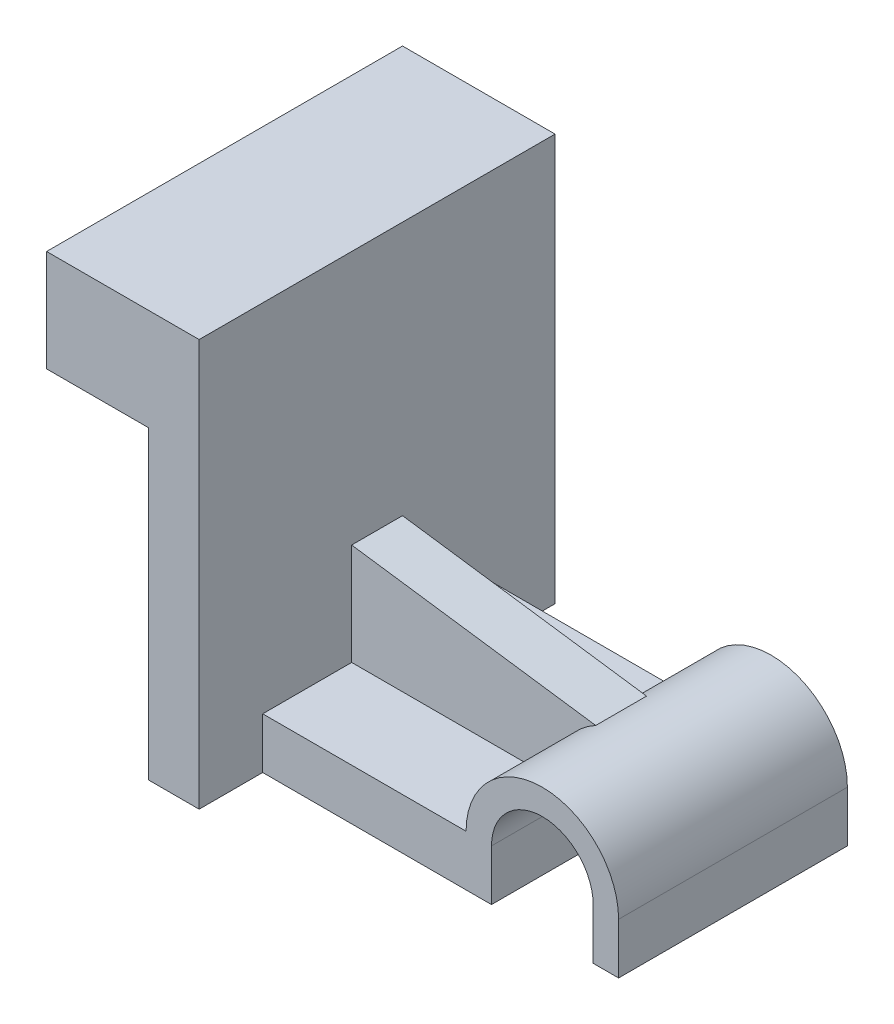
ISO-10303-21;
HEADER;
FILE_DESCRIPTION(('STEP AP214'),'2;1');
FILE_NAME('part.step','',(''),(''),'','','');
FILE_SCHEMA(('AUTOMOTIVE_DESIGN { 1 0 10303 214 1 1 1 1 }'));
ENDSEC;
DATA;
#1=APPLICATION_CONTEXT('core data for automotive mechanical design processes');
#2=APPLICATION_PROTOCOL_DEFINITION('international standard','automotive_design',2000,#1);
#3=PRODUCT_CONTEXT('',#1,'mechanical');
#4=PRODUCT('Part','Part','',(#3));
#5=PRODUCT_RELATED_PRODUCT_CATEGORY('part','',(#4));
#6=PRODUCT_DEFINITION_FORMATION('','',#4);
#7=PRODUCT_DEFINITION_CONTEXT('part definition',#1,'design');
#8=PRODUCT_DEFINITION('design','',#6,#7);
#9=PRODUCT_DEFINITION_SHAPE('','',#8);
#10=(LENGTH_UNIT() NAMED_UNIT(*) SI_UNIT(.MILLI.,.METRE.));
#11=(NAMED_UNIT(*) PLANE_ANGLE_UNIT() SI_UNIT($,.RADIAN.));
#12=(NAMED_UNIT(*) SI_UNIT($,.STERADIAN.) SOLID_ANGLE_UNIT());
#13=UNCERTAINTY_MEASURE_WITH_UNIT(LENGTH_MEASURE(1.E-05),#10,'distance_accuracy_value','');
#14=(GEOMETRIC_REPRESENTATION_CONTEXT(3) GLOBAL_UNCERTAINTY_ASSIGNED_CONTEXT((#13)) GLOBAL_UNIT_ASSIGNED_CONTEXT((#10,
#11,#12)) REPRESENTATION_CONTEXT('',''));
#15=CARTESIAN_POINT('',(0.,0.,0.));
#16=DIRECTION('',(0.,0.,1.));
#17=DIRECTION('',(1.,0.,0.));
#18=AXIS2_PLACEMENT_3D('',#15,#16,#17);
#19=CARTESIAN_POINT('',(0.,0.,-45.));
#20=DIRECTION('',(0.,0.,1.));
#21=DIRECTION('',(1.,0.,0.));
#22=AXIS2_PLACEMENT_3D('',#19,#20,#21);
#23=CYLINDRICAL_SURFACE('',#22,10.);
#24=CARTESIAN_POINT('',(0.,0.,0.));
#25=DIRECTION('',(0.,0.,1.));
#26=DIRECTION('',(1.,0.,0.));
#27=AXIS2_PLACEMENT_3D('',#24,#25,#26);
#28=CIRCLE('',#27,10.);
#29=CARTESIAN_POINT('',(10.,0.,0.));
#30=VERTEX_POINT('',#29);
#31=CARTESIAN_POINT('',(-10.,0.,0.));
#32=VERTEX_POINT('',#31);
#33=EDGE_CURVE('E272',#30,#32,#28,.T.);
#34=ORIENTED_EDGE('',*,*,#33,.T.);
#35=DIRECTION('',(0.,0.,1.));
#36=VECTOR('',#35,1.);
#37=CARTESIAN_POINT('',(-10.,0.,-45.));
#38=LINE('',#37,#36);
#39=CARTESIAN_POINT('',(-10.,0.,-45.));
#40=VERTEX_POINT('',#39);
#41=EDGE_CURVE('E298',#40,#32,#38,.T.);
#42=ORIENTED_EDGE('',*,*,#41,.F.);
#43=CARTESIAN_POINT('',(0.,0.,-45.));
#44=DIRECTION('',(0.,0.,1.));
#45=DIRECTION('',(1.,0.,0.));
#46=AXIS2_PLACEMENT_3D('',#43,#44,#45);
#47=CIRCLE('',#46,10.);
#48=CARTESIAN_POINT('',(10.,0.,-45.));
#49=VERTEX_POINT('',#48);
#50=EDGE_CURVE('E249',#49,#40,#47,.T.);
#51=ORIENTED_EDGE('',*,*,#50,.F.);
#52=DIRECTION('',(0.,0.,1.));
#53=VECTOR('',#52,1.);
#54=CARTESIAN_POINT('',(10.,0.,-45.));
#55=LINE('',#54,#53);
#56=EDGE_CURVE('E300',#49,#30,#55,.T.);
#57=ORIENTED_EDGE('',*,*,#56,.T.);
#58=EDGE_LOOP('',(#34,#42,#51,#57));
#59=FACE_BOUND('',#58,.T.);
#60=ADVANCED_FACE('F33',(#59),#23,.F.);
#61=CARTESIAN_POINT('',(-15.,0.,-45.));
#62=DIRECTION('',(0.,1.,0.));
#63=DIRECTION('',(-1.,0.,0.));
#64=AXIS2_PLACEMENT_3D('',#61,#62,#63);
#65=PLANE('',#64);
#66=DIRECTION('',(0.,0.,1.));
#67=VECTOR('',#66,1.);
#68=CARTESIAN_POINT('',(-15.,0.,-45.));
#69=LINE('',#68,#67);
#70=CARTESIAN_POINT('',(-15.,0.,-17.5));
#71=VERTEX_POINT('',#70);
#72=CARTESIAN_POINT('',(-15.,0.,0.));
#73=VERTEX_POINT('',#72);
#74=EDGE_CURVE('E288',#71,#73,#69,.T.);
#75=ORIENTED_EDGE('',*,*,#74,.F.);
#76=DIRECTION('',(-1.,0.,0.));
#77=VECTOR('',#76,1.);
#78=CARTESIAN_POINT('',(-6.99999999999999,0.,-17.5));
#79=LINE('',#78,#77);
#80=CARTESIAN_POINT('',(-55.,0.,-17.5));
#81=VERTEX_POINT('',#80);
#82=EDGE_CURVE('E187',#71,#81,#79,.T.);
#83=ORIENTED_EDGE('',*,*,#82,.T.);
#84=DIRECTION('',(0.,0.,1.));
#85=VECTOR('',#84,1.);
#86=CARTESIAN_POINT('',(-55.,0.,-45.));
#87=LINE('',#86,#85);
#88=CARTESIAN_POINT('',(-55.,0.,0.));
#89=VERTEX_POINT('',#88);
#90=EDGE_CURVE('E180',#81,#89,#87,.T.);
#91=ORIENTED_EDGE('',*,*,#90,.T.);
#92=DIRECTION('',(-1.,0.,0.));
#93=VECTOR('',#92,1.);
#94=CARTESIAN_POINT('',(-15.,0.,0.));
#95=LINE('',#94,#93);
#96=EDGE_CURVE('E282',#73,#89,#95,.T.);
#97=ORIENTED_EDGE('',*,*,#96,.F.);
#98=EDGE_LOOP('',(#75,#83,#91,#97));
#99=FACE_BOUND('',#98,.T.);
#100=ADVANCED_FACE('F317',(#99),#65,.T.);
#101=CARTESIAN_POINT('',(-55.,0.,-45.));
#102=VERTEX_POINT('',#101);
#103=CARTESIAN_POINT('',(-55.,0.,-27.5));
#104=VERTEX_POINT('',#103);
#105=EDGE_CURVE('E292',#102,#104,#87,.T.);
#106=ORIENTED_EDGE('',*,*,#105,.T.);
#107=DIRECTION('',(-1.,0.,0.));
#108=VECTOR('',#107,1.);
#109=CARTESIAN_POINT('',(-6.99999999999999,0.,-27.5));
#110=LINE('',#109,#108);
#111=CARTESIAN_POINT('',(-15.,0.,-27.5));
#112=VERTEX_POINT('',#111);
#113=EDGE_CURVE('E168',#112,#104,#110,.T.);
#114=ORIENTED_EDGE('',*,*,#113,.F.);
#115=CARTESIAN_POINT('',(-15.,0.,-45.));
#116=VERTEX_POINT('',#115);
#117=EDGE_CURVE('E289',#116,#112,#69,.T.);
#118=ORIENTED_EDGE('',*,*,#117,.F.);
#119=DIRECTION('',(-1.,0.,0.));
#120=VECTOR('',#119,1.);
#121=CARTESIAN_POINT('',(-15.,0.,-45.));
#122=LINE('',#121,#120);
#123=EDGE_CURVE('E258',#116,#102,#122,.T.);
#124=ORIENTED_EDGE('',*,*,#123,.T.);
#125=EDGE_LOOP('',(#106,#114,#118,#124));
#126=FACE_BOUND('',#125,.T.);
#127=ADVANCED_FACE('F347',(#126),#65,.T.);
#128=CARTESIAN_POINT('',(0.,0.,-45.));
#129=DIRECTION('',(0.,0.,1.));
#130=DIRECTION('',(1.,0.,0.));
#131=AXIS2_PLACEMENT_3D('',#128,#129,#130);
#132=CYLINDRICAL_SURFACE('',#131,15.);
#133=CARTESIAN_POINT('',(0.,0.,-27.5));
#134=DIRECTION('',(0.,0.,1.));
#135=DIRECTION('',(1.,0.,0.));
#136=AXIS2_PLACEMENT_3D('',#133,#134,#135);
#137=CIRCLE('',#136,15.);
#138=CARTESIAN_POINT('',(-6.99999999999999,13.2664991614216,-27.5));
#139=VERTEX_POINT('',#138);
#140=EDGE_CURVE('E189',#112,#139,#137,.F.);
#141=ORIENTED_EDGE('',*,*,#140,.T.);
#142=DIRECTION('',(0.,0.,1.));
#143=VECTOR('',#142,1.);
#144=CARTESIAN_POINT('',(-6.99999999999999,13.2664991614216,-45.));
#145=LINE('',#144,#143);
#146=CARTESIAN_POINT('',(-6.99999999999999,13.2664991614216,-17.5));
#147=VERTEX_POINT('',#146);
#148=EDGE_CURVE('E11',#139,#147,#145,.T.);
#149=ORIENTED_EDGE('',*,*,#148,.T.);
#150=CARTESIAN_POINT('',(0.,0.,-17.5));
#151=DIRECTION('',(0.,0.,-1.));
#152=DIRECTION('',(-1.,0.,0.));
#153=AXIS2_PLACEMENT_3D('',#150,#151,#152);
#154=CIRCLE('',#153,15.);
#155=EDGE_CURVE('E54',#147,#71,#154,.F.);
#156=ORIENTED_EDGE('',*,*,#155,.T.);
#157=ORIENTED_EDGE('',*,*,#74,.T.);
#158=CARTESIAN_POINT('',(0.,0.,0.));
#159=DIRECTION('',(0.,0.,1.));
#160=DIRECTION('',(1.,0.,0.));
#161=AXIS2_PLACEMENT_3D('',#158,#159,#160);
#162=CIRCLE('',#161,15.);
#163=CARTESIAN_POINT('',(15.,0.,0.));
#164=VERTEX_POINT('',#163);
#165=EDGE_CURVE('E244',#164,#73,#162,.T.);
#166=ORIENTED_EDGE('',*,*,#165,.F.);
#167=DIRECTION('',(0.,0.,1.));
#168=VECTOR('',#167,1.);
#169=CARTESIAN_POINT('',(15.,0.,-45.));
#170=LINE('',#169,#168);
#171=CARTESIAN_POINT('',(15.,0.,-45.));
#172=VERTEX_POINT('',#171);
#173=EDGE_CURVE('E263',#172,#164,#170,.T.);
#174=ORIENTED_EDGE('',*,*,#173,.F.);
#175=CARTESIAN_POINT('',(0.,0.,-45.));
#176=DIRECTION('',(0.,0.,1.));
#177=DIRECTION('',(1.,0.,0.));
#178=AXIS2_PLACEMENT_3D('',#175,#176,#177);
#179=CIRCLE('',#178,15.);
#180=EDGE_CURVE('E261',#172,#116,#179,.T.);
#181=ORIENTED_EDGE('',*,*,#180,.T.);
#182=ORIENTED_EDGE('',*,*,#117,.T.);
#183=EDGE_LOOP('',(#141,#149,#156,#157,#166,#174,#181,#182));
#184=FACE_BOUND('',#183,.T.);
#185=ADVANCED_FACE('F314',(#184),#132,.T.);
#186=CARTESIAN_POINT('',(-55.,0.,0.));
#187=DIRECTION('',(-1.,0.,0.));
#188=DIRECTION('',(0.,0.,1.));
#189=AXIS2_PLACEMENT_3D('',#186,#187,#188);
#190=PLANE('',#189);
#191=DIRECTION('',(0.,0.,1.));
#192=VECTOR('',#191,1.);
#193=CARTESIAN_POINT('',(-55.,20.,-17.5));
#194=LINE('',#193,#192);
#195=CARTESIAN_POINT('',(-55.,20.,-27.5));
#196=VERTEX_POINT('',#195);
#197=CARTESIAN_POINT('',(-55.,20.,-17.5));
#198=VERTEX_POINT('',#197);
#199=EDGE_CURVE('E161',#196,#198,#194,.T.);
#200=ORIENTED_EDGE('',*,*,#199,.F.);
#201=DIRECTION('',(0.,1.,0.));
#202=VECTOR('',#201,1.);
#203=CARTESIAN_POINT('',(-55.,0.,-27.5));
#204=LINE('',#203,#202);
#205=EDGE_CURVE('E169',#104,#196,#204,.T.);
#206=ORIENTED_EDGE('',*,*,#205,.F.);
#207=ORIENTED_EDGE('',*,*,#105,.F.);
#208=DIRECTION('',(0.,-1.,0.));
#209=VECTOR('',#208,1.);
#210=CARTESIAN_POINT('',(-55.,0.,-45.));
#211=LINE('',#210,#209);
#212=CARTESIAN_POINT('',(-55.,-10.,-45.));
#213=VERTEX_POINT('',#212);
#214=EDGE_CURVE('E255',#102,#213,#211,.T.);
#215=ORIENTED_EDGE('',*,*,#214,.T.);
#216=DIRECTION('',(0.,0.,1.));
#217=VECTOR('',#216,1.);
#218=CARTESIAN_POINT('',(-55.,-10.,-57.5));
#219=LINE('',#218,#217);
#220=CARTESIAN_POINT('',(-55.,-10.,-57.5));
#221=VERTEX_POINT('',#220);
#222=EDGE_CURVE('E223',#221,#213,#219,.T.);
#223=ORIENTED_EDGE('',*,*,#222,.F.);
#224=DIRECTION('',(0.,-1.,0.));
#225=VECTOR('',#224,1.);
#226=CARTESIAN_POINT('',(-55.,70.,-57.5));
#227=LINE('',#226,#225);
#228=CARTESIAN_POINT('',(-55.,70.,-57.5));
#229=VERTEX_POINT('',#228);
#230=EDGE_CURVE('E208',#229,#221,#227,.T.);
#231=ORIENTED_EDGE('',*,*,#230,.F.);
#232=DIRECTION('',(0.,0.,1.));
#233=VECTOR('',#232,1.);
#234=CARTESIAN_POINT('',(-55.,70.,-57.5));
#235=LINE('',#234,#233);
#236=CARTESIAN_POINT('',(-55.,70.,12.5));
#237=VERTEX_POINT('',#236);
#238=EDGE_CURVE('E214',#229,#237,#235,.T.);
#239=ORIENTED_EDGE('',*,*,#238,.T.);
#240=DIRECTION('',(0.,-1.,0.));
#241=VECTOR('',#240,1.);
#242=CARTESIAN_POINT('',(-55.,70.,12.5));
#243=LINE('',#242,#241);
#244=CARTESIAN_POINT('',(-55.,-10.,12.5));
#245=VERTEX_POINT('',#244);
#246=EDGE_CURVE('E226',#237,#245,#243,.T.);
#247=ORIENTED_EDGE('',*,*,#246,.T.);
#248=CARTESIAN_POINT('',(-55.,-10.,0.));
#249=VERTEX_POINT('',#248);
#250=EDGE_CURVE('E222',#249,#245,#219,.T.);
#251=ORIENTED_EDGE('',*,*,#250,.F.);
#252=DIRECTION('',(0.,-1.,0.));
#253=VECTOR('',#252,1.);
#254=CARTESIAN_POINT('',(-55.,0.,0.));
#255=LINE('',#254,#253);
#256=EDGE_CURVE('E279',#89,#249,#255,.T.);
#257=ORIENTED_EDGE('',*,*,#256,.F.);
#258=ORIENTED_EDGE('',*,*,#90,.F.);
#259=DIRECTION('',(0.,-1.,0.));
#260=VECTOR('',#259,1.);
#261=CARTESIAN_POINT('',(-55.,0.,-17.5));
#262=LINE('',#261,#260);
#263=EDGE_CURVE('E175',#198,#81,#262,.T.);
#264=ORIENTED_EDGE('',*,*,#263,.F.);
#265=EDGE_LOOP('',(#200,#206,#207,#215,#223,#231,#239,#247,#251,#257,#258,#264));
#266=FACE_BOUND('',#265,.T.);
#267=ADVANCED_FACE('F178',(#266),#190,.F.);
#268=CARTESIAN_POINT('',(-10.,-10.,-45.));
#269=DIRECTION('',(0.,1.,0.));
#270=DIRECTION('',(-1.,0.,0.));
#271=AXIS2_PLACEMENT_3D('',#268,#269,#270);
#272=PLANE('',#271);
#273=DIRECTION('',(0.,0.,1.));
#274=VECTOR('',#273,1.);
#275=CARTESIAN_POINT('',(-65.,-10.,-57.5));
#276=LINE('',#275,#274);
#277=CARTESIAN_POINT('',(-65.,-10.,-57.5));
#278=VERTEX_POINT('',#277);
#279=CARTESIAN_POINT('',(-65.,-10.,12.5));
#280=VERTEX_POINT('',#279);
#281=EDGE_CURVE('E196',#278,#280,#276,.T.);
#282=ORIENTED_EDGE('',*,*,#281,.F.);
#283=DIRECTION('',(1.,0.,0.));
#284=VECTOR('',#283,1.);
#285=CARTESIAN_POINT('',(-85.,-10.,-57.5));
#286=LINE('',#285,#284);
#287=EDGE_CURVE('E236',#278,#221,#286,.T.);
#288=ORIENTED_EDGE('',*,*,#287,.T.);
#289=ORIENTED_EDGE('',*,*,#222,.T.);
#290=DIRECTION('',(-1.,0.,0.));
#291=VECTOR('',#290,1.);
#292=CARTESIAN_POINT('',(-10.,-10.,-45.));
#293=LINE('',#292,#291);
#294=CARTESIAN_POINT('',(-10.,-10.,-45.));
#295=VERTEX_POINT('',#294);
#296=EDGE_CURVE('E253',#295,#213,#293,.T.);
#297=ORIENTED_EDGE('',*,*,#296,.F.);
#298=DIRECTION('',(0.,0.,1.));
#299=VECTOR('',#298,1.);
#300=CARTESIAN_POINT('',(-10.,-10.,-45.));
#301=LINE('',#300,#299);
#302=CARTESIAN_POINT('',(-10.,-10.,0.));
#303=VERTEX_POINT('',#302);
#304=EDGE_CURVE('E295',#295,#303,#301,.T.);
#305=ORIENTED_EDGE('',*,*,#304,.T.);
#306=DIRECTION('',(-1.,0.,0.));
#307=VECTOR('',#306,1.);
#308=CARTESIAN_POINT('',(-10.,-10.,0.));
#309=LINE('',#308,#307);
#310=EDGE_CURVE('E277',#303,#249,#309,.T.);
#311=ORIENTED_EDGE('',*,*,#310,.T.);
#312=ORIENTED_EDGE('',*,*,#250,.T.);
#313=DIRECTION('',(1.,0.,0.));
#314=VECTOR('',#313,1.);
#315=CARTESIAN_POINT('',(-85.,-10.,12.5));
#316=LINE('',#315,#314);
#317=EDGE_CURVE('E234',#280,#245,#316,.T.);
#318=ORIENTED_EDGE('',*,*,#317,.F.);
#319=EDGE_LOOP('',(#282,#288,#289,#297,#305,#311,#312,#318));
#320=FACE_BOUND('',#319,.T.);
#321=ADVANCED_FACE('F325',(#320),#272,.F.);
#322=CARTESIAN_POINT('',(15.,0.,-45.));
#323=DIRECTION('',(-1.,0.,0.));
#324=DIRECTION('',(0.,-1.,0.));
#325=AXIS2_PLACEMENT_3D('',#322,#323,#324);
#326=PLANE('',#325);
#327=DIRECTION('',(0.,-1.,0.));
#328=VECTOR('',#327,1.);
#329=CARTESIAN_POINT('',(15.,0.,0.));
#330=LINE('',#329,#328);
#331=CARTESIAN_POINT('',(15.,-10.,0.));
#332=VERTEX_POINT('',#331);
#333=EDGE_CURVE('E239',#164,#332,#330,.T.);
#334=ORIENTED_EDGE('',*,*,#333,.T.);
#335=DIRECTION('',(0.,0.,1.));
#336=VECTOR('',#335,1.);
#337=CARTESIAN_POINT('',(15.,-10.,-45.));
#338=LINE('',#337,#336);
#339=CARTESIAN_POINT('',(15.,-10.,-45.));
#340=VERTEX_POINT('',#339);
#341=EDGE_CURVE('E41',#340,#332,#338,.T.);
#342=ORIENTED_EDGE('',*,*,#341,.F.);
#343=DIRECTION('',(0.,-1.,0.));
#344=VECTOR('',#343,1.);
#345=CARTESIAN_POINT('',(15.,0.,-45.));
#346=LINE('',#345,#344);
#347=EDGE_CURVE('E240',#172,#340,#346,.T.);
#348=ORIENTED_EDGE('',*,*,#347,.F.);
#349=ORIENTED_EDGE('',*,*,#173,.T.);
#350=EDGE_LOOP('',(#334,#342,#348,#349));
#351=FACE_BOUND('',#350,.T.);
#352=ADVANCED_FACE('F35',(#351),#326,.F.);
#353=CARTESIAN_POINT('',(15.,-10.,-45.));
#354=DIRECTION('',(0.,1.,0.));
#355=DIRECTION('',(0.,0.,1.));
#356=AXIS2_PLACEMENT_3D('',#353,#354,#355);
#357=PLANE('',#356);
#358=DIRECTION('',(-1.,0.,0.));
#359=VECTOR('',#358,1.);
#360=CARTESIAN_POINT('',(15.,-10.,0.));
#361=LINE('',#360,#359);
#362=CARTESIAN_POINT('',(10.,-10.,0.));
#363=VERTEX_POINT('',#362);
#364=EDGE_CURVE('E266',#332,#363,#361,.T.);
#365=ORIENTED_EDGE('',*,*,#364,.T.);
#366=DIRECTION('',(0.,0.,1.));
#367=VECTOR('',#366,1.);
#368=CARTESIAN_POINT('',(10.,-10.,-45.));
#369=LINE('',#368,#367);
#370=CARTESIAN_POINT('',(10.,-10.,-45.));
#371=VERTEX_POINT('',#370);
#372=EDGE_CURVE('E302',#371,#363,#369,.T.);
#373=ORIENTED_EDGE('',*,*,#372,.F.);
#374=DIRECTION('',(-1.,0.,0.));
#375=VECTOR('',#374,1.);
#376=CARTESIAN_POINT('',(15.,-10.,-45.));
#377=LINE('',#376,#375);
#378=EDGE_CURVE('E243',#340,#371,#377,.T.);
#379=ORIENTED_EDGE('',*,*,#378,.F.);
#380=ORIENTED_EDGE('',*,*,#341,.T.);
#381=EDGE_LOOP('',(#365,#373,#379,#380));
#382=FACE_BOUND('',#381,.T.);
#383=ADVANCED_FACE('F306',(#382),#357,.F.);
#384=CARTESIAN_POINT('',(10.,0.,-45.));
#385=DIRECTION('',(-1.,0.,0.));
#386=DIRECTION('',(0.,0.,1.));
#387=AXIS2_PLACEMENT_3D('',#384,#385,#386);
#388=PLANE('',#387);
#389=DIRECTION('',(0.,-1.,0.));
#390=VECTOR('',#389,1.);
#391=CARTESIAN_POINT('',(10.,0.,0.));
#392=LINE('',#391,#390);
#393=EDGE_CURVE('E269',#30,#363,#392,.T.);
#394=ORIENTED_EDGE('',*,*,#393,.F.);
#395=ORIENTED_EDGE('',*,*,#56,.F.);
#396=DIRECTION('',(0.,-1.,0.));
#397=VECTOR('',#396,1.);
#398=CARTESIAN_POINT('',(10.,0.,-45.));
#399=LINE('',#398,#397);
#400=EDGE_CURVE('E246',#49,#371,#399,.T.);
#401=ORIENTED_EDGE('',*,*,#400,.T.);
#402=ORIENTED_EDGE('',*,*,#372,.T.);
#403=EDGE_LOOP('',(#394,#395,#401,#402));
#404=FACE_BOUND('',#403,.T.);
#405=ADVANCED_FACE('F339',(#404),#388,.T.);
#406=CARTESIAN_POINT('',(-10.,0.,-45.));
#407=DIRECTION('',(-1.,0.,0.));
#408=DIRECTION('',(0.,0.,1.));
#409=AXIS2_PLACEMENT_3D('',#406,#407,#408);
#410=PLANE('',#409);
#411=DIRECTION('',(0.,-1.,0.));
#412=VECTOR('',#411,1.);
#413=CARTESIAN_POINT('',(-10.,0.,0.));
#414=LINE('',#413,#412);
#415=EDGE_CURVE('E275',#32,#303,#414,.T.);
#416=ORIENTED_EDGE('',*,*,#415,.T.);
#417=ORIENTED_EDGE('',*,*,#304,.F.);
#418=DIRECTION('',(0.,-1.,0.));
#419=VECTOR('',#418,1.);
#420=CARTESIAN_POINT('',(-10.,0.,-45.));
#421=LINE('',#420,#419);
#422=EDGE_CURVE('E251',#40,#295,#421,.T.);
#423=ORIENTED_EDGE('',*,*,#422,.F.);
#424=ORIENTED_EDGE('',*,*,#41,.T.);
#425=EDGE_LOOP('',(#416,#417,#423,#424));
#426=FACE_BOUND('',#425,.T.);
#427=ADVANCED_FACE('F332',(#426),#410,.F.);
#428=CARTESIAN_POINT('',(0.,0.,-45.));
#429=DIRECTION('',(0.,0.,1.));
#430=DIRECTION('',(1.,0.,0.));
#431=AXIS2_PLACEMENT_3D('',#428,#429,#430);
#432=PLANE('',#431);
#433=ORIENTED_EDGE('',*,*,#347,.T.);
#434=ORIENTED_EDGE('',*,*,#378,.T.);
#435=ORIENTED_EDGE('',*,*,#400,.F.);
#436=ORIENTED_EDGE('',*,*,#50,.T.);
#437=ORIENTED_EDGE('',*,*,#422,.T.);
#438=ORIENTED_EDGE('',*,*,#296,.T.);
#439=ORIENTED_EDGE('',*,*,#214,.F.);
#440=ORIENTED_EDGE('',*,*,#123,.F.);
#441=ORIENTED_EDGE('',*,*,#180,.F.);
#442=EDGE_LOOP('',(#433,#434,#435,#436,#437,#438,#439,#440,#441));
#443=FACE_BOUND('',#442,.T.);
#444=ADVANCED_FACE('F341',(#443),#432,.F.);
#445=CARTESIAN_POINT('',(0.,0.,0.));
#446=DIRECTION('',(0.,0.,1.));
#447=DIRECTION('',(1.,0.,0.));
#448=AXIS2_PLACEMENT_3D('',#445,#446,#447);
#449=PLANE('',#448);
#450=ORIENTED_EDGE('',*,*,#333,.F.);
#451=ORIENTED_EDGE('',*,*,#165,.T.);
#452=ORIENTED_EDGE('',*,*,#96,.T.);
#453=ORIENTED_EDGE('',*,*,#256,.T.);
#454=ORIENTED_EDGE('',*,*,#310,.F.);
#455=ORIENTED_EDGE('',*,*,#415,.F.);
#456=ORIENTED_EDGE('',*,*,#33,.F.);
#457=ORIENTED_EDGE('',*,*,#393,.T.);
#458=ORIENTED_EDGE('',*,*,#364,.F.);
#459=EDGE_LOOP('',(#450,#451,#452,#453,#454,#455,#456,#457,#458));
#460=FACE_BOUND('',#459,.T.);
#461=ADVANCED_FACE('F313',(#460),#449,.T.);
#462=CARTESIAN_POINT('',(-85.,70.,-57.5));
#463=DIRECTION('',(0.,0.,1.));
#464=DIRECTION('',(0.,-1.,0.));
#465=AXIS2_PLACEMENT_3D('',#462,#463,#464);
#466=PLANE('',#465);
#467=DIRECTION('',(0.,-1.,0.));
#468=VECTOR('',#467,1.);
#469=CARTESIAN_POINT('',(-65.,50.,-57.5));
#470=LINE('',#469,#468);
#471=CARTESIAN_POINT('',(-65.,50.,-57.5));
#472=VERTEX_POINT('',#471);
#473=EDGE_CURVE('E194',#472,#278,#470,.T.);
#474=ORIENTED_EDGE('',*,*,#473,.F.);
#475=DIRECTION('',(-1.,0.,0.));
#476=VECTOR('',#475,1.);
#477=CARTESIAN_POINT('',(-65.,50.,-57.5));
#478=LINE('',#477,#476);
#479=CARTESIAN_POINT('',(-85.,50.,-57.5));
#480=VERTEX_POINT('',#479);
#481=EDGE_CURVE('E205',#472,#480,#478,.T.);
#482=ORIENTED_EDGE('',*,*,#481,.T.);
#483=DIRECTION('',(0.,-1.,0.));
#484=VECTOR('',#483,1.);
#485=CARTESIAN_POINT('',(-85.,70.,-57.5));
#486=LINE('',#485,#484);
#487=CARTESIAN_POINT('',(-85.,70.,-57.5));
#488=VERTEX_POINT('',#487);
#489=EDGE_CURVE('E210',#488,#480,#486,.T.);
#490=ORIENTED_EDGE('',*,*,#489,.F.);
#491=DIRECTION('',(1.,0.,0.));
#492=VECTOR('',#491,1.);
#493=CARTESIAN_POINT('',(-85.,70.,-57.5));
#494=LINE('',#493,#492);
#495=EDGE_CURVE('E220',#488,#229,#494,.T.);
#496=ORIENTED_EDGE('',*,*,#495,.T.);
#497=ORIENTED_EDGE('',*,*,#230,.T.);
#498=ORIENTED_EDGE('',*,*,#287,.F.);
#499=EDGE_LOOP('',(#474,#482,#490,#496,#497,#498));
#500=FACE_BOUND('',#499,.T.);
#501=ADVANCED_FACE('F356',(#500),#466,.F.);
#502=CARTESIAN_POINT('',(-85.,70.,12.5));
#503=DIRECTION('',(0.,0.,1.));
#504=DIRECTION('',(0.,-1.,0.));
#505=AXIS2_PLACEMENT_3D('',#502,#503,#504);
#506=PLANE('',#505);
#507=DIRECTION('',(-1.,0.,0.));
#508=VECTOR('',#507,1.);
#509=CARTESIAN_POINT('',(-65.,50.,12.5));
#510=LINE('',#509,#508);
#511=CARTESIAN_POINT('',(-65.,50.,12.5));
#512=VERTEX_POINT('',#511);
#513=CARTESIAN_POINT('',(-85.,50.,12.5));
#514=VERTEX_POINT('',#513);
#515=EDGE_CURVE('E203',#512,#514,#510,.T.);
#516=ORIENTED_EDGE('',*,*,#515,.F.);
#517=DIRECTION('',(0.,1.,0.));
#518=VECTOR('',#517,1.);
#519=CARTESIAN_POINT('',(-65.,50.,12.5));
#520=LINE('',#519,#518);
#521=EDGE_CURVE('E198',#280,#512,#520,.T.);
#522=ORIENTED_EDGE('',*,*,#521,.F.);
#523=ORIENTED_EDGE('',*,*,#317,.T.);
#524=ORIENTED_EDGE('',*,*,#246,.F.);
#525=DIRECTION('',(1.,0.,0.));
#526=VECTOR('',#525,1.);
#527=CARTESIAN_POINT('',(-85.,70.,12.5));
#528=LINE('',#527,#526);
#529=CARTESIAN_POINT('',(-85.,70.,12.5));
#530=VERTEX_POINT('',#529);
#531=EDGE_CURVE('E232',#530,#237,#528,.T.);
#532=ORIENTED_EDGE('',*,*,#531,.F.);
#533=DIRECTION('',(0.,-1.,0.));
#534=VECTOR('',#533,1.);
#535=CARTESIAN_POINT('',(-85.,70.,12.5));
#536=LINE('',#535,#534);
#537=EDGE_CURVE('E213',#530,#514,#536,.T.);
#538=ORIENTED_EDGE('',*,*,#537,.T.);
#539=EDGE_LOOP('',(#516,#522,#523,#524,#532,#538));
#540=FACE_BOUND('',#539,.T.);
#541=ADVANCED_FACE('F365',(#540),#506,.T.);
#542=CARTESIAN_POINT('',(-85.,70.,-57.5));
#543=DIRECTION('',(0.,1.,0.));
#544=DIRECTION('',(0.,0.,1.));
#545=AXIS2_PLACEMENT_3D('',#542,#543,#544);
#546=PLANE('',#545);
#547=ORIENTED_EDGE('',*,*,#238,.F.);
#548=ORIENTED_EDGE('',*,*,#495,.F.);
#549=DIRECTION('',(0.,0.,1.));
#550=VECTOR('',#549,1.);
#551=CARTESIAN_POINT('',(-85.,70.,-57.5));
#552=LINE('',#551,#550);
#553=EDGE_CURVE('E217',#488,#530,#552,.T.);
#554=ORIENTED_EDGE('',*,*,#553,.T.);
#555=ORIENTED_EDGE('',*,*,#531,.T.);
#556=EDGE_LOOP('',(#547,#548,#554,#555));
#557=FACE_BOUND('',#556,.T.);
#558=ADVANCED_FACE('F360',(#557),#546,.T.);
#559=CARTESIAN_POINT('',(-85.,0.,0.));
#560=DIRECTION('',(-1.,0.,0.));
#561=DIRECTION('',(0.,0.,1.));
#562=AXIS2_PLACEMENT_3D('',#559,#560,#561);
#563=PLANE('',#562);
#564=DIRECTION('',(0.,0.,-1.));
#565=VECTOR('',#564,1.);
#566=CARTESIAN_POINT('',(-85.,50.,-57.5));
#567=LINE('',#566,#565);
#568=EDGE_CURVE('E193',#514,#480,#567,.T.);
#569=ORIENTED_EDGE('',*,*,#568,.F.);
#570=ORIENTED_EDGE('',*,*,#537,.F.);
#571=ORIENTED_EDGE('',*,*,#553,.F.);
#572=ORIENTED_EDGE('',*,*,#489,.T.);
#573=EDGE_LOOP('',(#569,#570,#571,#572));
#574=FACE_BOUND('',#573,.T.);
#575=ADVANCED_FACE('F374',(#574),#563,.T.);
#576=CARTESIAN_POINT('',(-65.,50.,-57.5));
#577=DIRECTION('',(0.,1.,0.));
#578=DIRECTION('',(0.,0.,1.));
#579=AXIS2_PLACEMENT_3D('',#576,#577,#578);
#580=PLANE('',#579);
#581=ORIENTED_EDGE('',*,*,#568,.T.);
#582=ORIENTED_EDGE('',*,*,#481,.F.);
#583=DIRECTION('',(0.,0.,-1.));
#584=VECTOR('',#583,1.);
#585=CARTESIAN_POINT('',(-65.,50.,-57.5));
#586=LINE('',#585,#584);
#587=EDGE_CURVE('E200',#512,#472,#586,.T.);
#588=ORIENTED_EDGE('',*,*,#587,.F.);
#589=ORIENTED_EDGE('',*,*,#515,.T.);
#590=EDGE_LOOP('',(#581,#582,#588,#589));
#591=FACE_BOUND('',#590,.T.);
#592=ADVANCED_FACE('F371',(#591),#580,.F.);
#593=CARTESIAN_POINT('',(-65.,0.,0.));
#594=DIRECTION('',(-1.,0.,0.));
#595=DIRECTION('',(0.,0.,1.));
#596=AXIS2_PLACEMENT_3D('',#593,#594,#595);
#597=PLANE('',#596);
#598=ORIENTED_EDGE('',*,*,#473,.T.);
#599=ORIENTED_EDGE('',*,*,#281,.T.);
#600=ORIENTED_EDGE('',*,*,#521,.T.);
#601=ORIENTED_EDGE('',*,*,#587,.T.);
#602=EDGE_LOOP('',(#598,#599,#600,#601));
#603=FACE_BOUND('',#602,.T.);
#604=ADVANCED_FACE('F369',(#603),#597,.T.);
#605=CARTESIAN_POINT('',(-6.99999999999999,0.,-27.5));
#606=DIRECTION('',(0.,0.,1.));
#607=DIRECTION('',(1.,0.,0.));
#608=AXIS2_PLACEMENT_3D('',#605,#606,#607);
#609=PLANE('',#608);
#610=ORIENTED_EDGE('',*,*,#205,.T.);
#611=DIRECTION('',(0.990303462995794,-0.13892102496936,0.));
#612=VECTOR('',#611,1.);
#613=CARTESIAN_POINT('',(-5.17487501436814,13.0104683151453,-27.5));
#614=LINE('',#613,#612);
#615=EDGE_CURVE('E164',#196,#139,#614,.T.);
#616=ORIENTED_EDGE('',*,*,#615,.T.);
#617=ORIENTED_EDGE('',*,*,#140,.F.);
#618=ORIENTED_EDGE('',*,*,#113,.T.);
#619=EDGE_LOOP('',(#610,#616,#617,#618));
#620=FACE_BOUND('',#619,.T.);
#621=ADVANCED_FACE('F350',(#620),#609,.F.);
#622=CARTESIAN_POINT('',(-6.99999999999999,0.,-17.5));
#623=DIRECTION('',(0.,0.,-1.));
#624=DIRECTION('',(-1.,0.,0.));
#625=AXIS2_PLACEMENT_3D('',#622,#623,#624);
#626=PLANE('',#625);
#627=ORIENTED_EDGE('',*,*,#155,.F.);
#628=DIRECTION('',(0.990303462995794,-0.13892102496936,0.));
#629=VECTOR('',#628,1.);
#630=CARTESIAN_POINT('',(-6.99999999999999,13.2664991614216,-17.5));
#631=LINE('',#630,#629);
#632=EDGE_CURVE('E48',#198,#147,#631,.T.);
#633=ORIENTED_EDGE('',*,*,#632,.F.);
#634=ORIENTED_EDGE('',*,*,#263,.T.);
#635=ORIENTED_EDGE('',*,*,#82,.F.);
#636=EDGE_LOOP('',(#627,#633,#634,#635));
#637=FACE_BOUND('',#636,.T.);
#638=ADVANCED_FACE('F173',(#637),#626,.F.);
#639=CARTESIAN_POINT('',(-6.99999999999999,13.2664991614216,-57.5));
#640=DIRECTION('',(-0.13892102496936,-0.990303462995794,0.));
#641=DIRECTION('',(0.990303462995794,-0.13892102496936,0.));
#642=AXIS2_PLACEMENT_3D('',#639,#640,#641);
#643=PLANE('',#642);
#644=ORIENTED_EDGE('',*,*,#199,.T.);
#645=ORIENTED_EDGE('',*,*,#632,.T.);
#646=ORIENTED_EDGE('',*,*,#148,.F.);
#647=ORIENTED_EDGE('',*,*,#615,.F.);
#648=EDGE_LOOP('',(#644,#645,#646,#647));
#649=FACE_BOUND('',#648,.T.);
#650=ADVANCED_FACE('F162',(#649),#643,.F.);
#651=CLOSED_SHELL('',(#60,#100,#127,#185,#267,#321,#352,#383,#405,#427,#444,#461,#501,#541,#558,
#575,#592,#604,#621,#638,#650));
#652=MANIFOLD_SOLID_BREP('B2',#651);
#653=ADVANCED_BREP_SHAPE_REPRESENTATION('',(#18,#652),#14);
#654=SHAPE_DEFINITION_REPRESENTATION(#9,#653);
ENDSEC;
END-ISO-10303-21;
